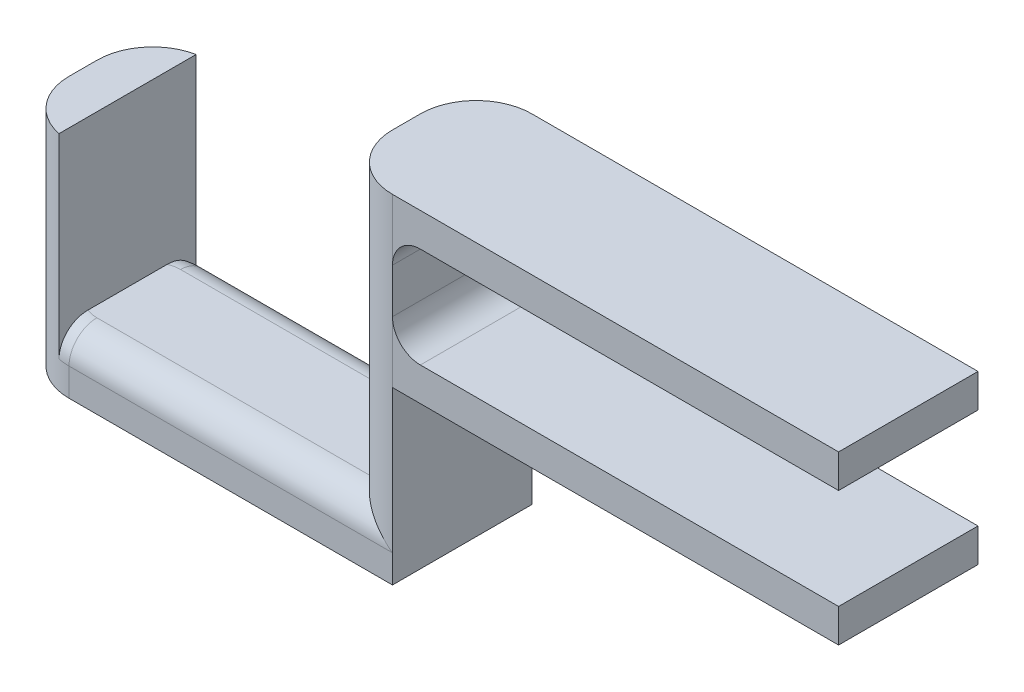
ISO-10303-21;
HEADER;
FILE_DESCRIPTION(('STEP AP214'),'2;1');
FILE_NAME('part.step','',(''),(''),'','','');
FILE_SCHEMA(('AUTOMOTIVE_DESIGN { 1 0 10303 214 1 1 1 1 }'));
ENDSEC;
DATA;
#1=APPLICATION_CONTEXT('core data for automotive mechanical design processes');
#2=APPLICATION_PROTOCOL_DEFINITION('international standard','automotive_design',2000,#1);
#3=PRODUCT_CONTEXT('',#1,'mechanical');
#4=PRODUCT('Part','Part','',(#3));
#5=PRODUCT_RELATED_PRODUCT_CATEGORY('part','',(#4));
#6=PRODUCT_DEFINITION_FORMATION('','',#4);
#7=PRODUCT_DEFINITION_CONTEXT('part definition',#1,'design');
#8=PRODUCT_DEFINITION('design','',#6,#7);
#9=PRODUCT_DEFINITION_SHAPE('','',#8);
#10=(LENGTH_UNIT() NAMED_UNIT(*) SI_UNIT(.MILLI.,.METRE.));
#11=(NAMED_UNIT(*) PLANE_ANGLE_UNIT() SI_UNIT($,.RADIAN.));
#12=(NAMED_UNIT(*) SI_UNIT($,.STERADIAN.) SOLID_ANGLE_UNIT());
#13=UNCERTAINTY_MEASURE_WITH_UNIT(LENGTH_MEASURE(1.E-05),#10,'distance_accuracy_value','');
#14=(GEOMETRIC_REPRESENTATION_CONTEXT(3) GLOBAL_UNCERTAINTY_ASSIGNED_CONTEXT((#13)) GLOBAL_UNIT_ASSIGNED_CONTEXT((#10,
#11,#12)) REPRESENTATION_CONTEXT('',''));
#15=CARTESIAN_POINT('',(0.,0.,0.));
#16=DIRECTION('',(0.,0.,1.));
#17=DIRECTION('',(1.,0.,0.));
#18=AXIS2_PLACEMENT_3D('',#15,#16,#17);
#19=CARTESIAN_POINT('',(17.70619495042,21.6478494623656,0.));
#20=DIRECTION('',(0.,0.,1.));
#21=DIRECTION('',(1.,0.,0.));
#22=AXIS2_PLACEMENT_3D('',#19,#20,#21);
#23=PLANE('',#22);
#24=DIRECTION('',(0.,-1.,0.));
#25=VECTOR('',#24,1.);
#26=CARTESIAN_POINT('',(-45.29380504958,21.6478494623656,0.));
#27=LINE('',#26,#25);
#28=CARTESIAN_POINT('',(-45.29380504958,-28.0241935483871,0.));
#29=VERTEX_POINT('',#28);
#30=CARTESIAN_POINT('',(-45.29380504958,-23.0241935483871,0.));
#31=VERTEX_POINT('',#30);
#32=EDGE_CURVE('E301',#29,#31,#27,.F.);
#33=ORIENTED_EDGE('',*,*,#32,.T.);
#34=DIRECTION('',(-1.,0.,0.));
#35=VECTOR('',#34,1.);
#36=CARTESIAN_POINT('',(17.70619495042,-23.0241935483871,0.));
#37=LINE('',#36,#35);
#38=CARTESIAN_POINT('',(12.70619495042,-23.0241935483871,0.));
#39=VERTEX_POINT('',#38);
#40=EDGE_CURVE('E359',#31,#39,#37,.F.);
#41=ORIENTED_EDGE('',*,*,#40,.T.);
#42=DIRECTION('',(0.,1.,0.));
#43=VECTOR('',#42,1.);
#44=CARTESIAN_POINT('',(12.70619495042,-28.0241935483871,0.));
#45=LINE('',#44,#43);
#46=CARTESIAN_POINT('',(12.70619495042,-28.0241935483871,0.));
#47=VERTEX_POINT('',#46);
#48=EDGE_CURVE('E236',#47,#39,#45,.T.);
#49=ORIENTED_EDGE('',*,*,#48,.F.);
#50=DIRECTION('',(1.,0.,0.));
#51=VECTOR('',#50,1.);
#52=CARTESIAN_POINT('',(-55.29380504958,-28.0241935483871,0.));
#53=LINE('',#52,#51);
#54=EDGE_CURVE('E204',#29,#47,#53,.T.);
#55=ORIENTED_EDGE('',*,*,#54,.F.);
#56=EDGE_LOOP('',(#33,#41,#49,#55));
#57=FACE_BOUND('',#56,.T.);
#58=ADVANCED_FACE('F35',(#57),#23,.F.);
#59=DIRECTION('',(1.,0.,0.));
#60=VECTOR('',#59,1.);
#61=CARTESIAN_POINT('',(12.70619495042,2.64784946236562,0.));
#62=LINE('',#61,#60);
#63=CARTESIAN_POINT('',(12.70619495042,2.64784946236562,0.));
#64=VERTEX_POINT('',#63);
#65=CARTESIAN_POINT('',(92.70619495042,2.64784946236562,0.));
#66=VERTEX_POINT('',#65);
#67=EDGE_CURVE('E238',#64,#66,#62,.T.);
#68=ORIENTED_EDGE('',*,*,#67,.F.);
#69=DIRECTION('',(0.,-1.,0.));
#70=VECTOR('',#69,1.);
#71=CARTESIAN_POINT('',(12.70619495042,21.6478494623656,0.));
#72=LINE('',#71,#70);
#73=CARTESIAN_POINT('',(12.70619495042,13.6478494623656,0.));
#74=VERTEX_POINT('',#73);
#75=EDGE_CURVE('E335',#64,#74,#72,.F.);
#76=ORIENTED_EDGE('',*,*,#75,.T.);
#77=CARTESIAN_POINT('',(17.70619495042,13.6478494623656,0.));
#78=DIRECTION('',(0.,0.,-1.));
#79=DIRECTION('',(-1.,0.,0.));
#80=AXIS2_PLACEMENT_3D('',#77,#78,#79);
#81=CIRCLE('',#80,5.);
#82=CARTESIAN_POINT('',(17.70619495042,8.64784946236562,0.));
#83=VERTEX_POINT('',#82);
#84=EDGE_CURVE('E244',#83,#74,#81,.T.);
#85=ORIENTED_EDGE('',*,*,#84,.F.);
#86=DIRECTION('',(-1.,0.,0.));
#87=VECTOR('',#86,1.);
#88=CARTESIAN_POINT('',(17.70619495042,8.64784946236562,0.));
#89=LINE('',#88,#87);
#90=CARTESIAN_POINT('',(92.70619495042,8.64784946236562,0.));
#91=VERTEX_POINT('',#90);
#92=EDGE_CURVE('E242',#91,#83,#89,.T.);
#93=ORIENTED_EDGE('',*,*,#92,.F.);
#94=DIRECTION('',(0.,1.,0.));
#95=VECTOR('',#94,1.);
#96=CARTESIAN_POINT('',(92.70619495042,8.64784946236562,0.));
#97=LINE('',#96,#95);
#98=EDGE_CURVE('E240',#66,#91,#97,.T.);
#99=ORIENTED_EDGE('',*,*,#98,.F.);
#100=EDGE_LOOP('',(#68,#76,#85,#93,#99));
#101=FACE_BOUND('',#100,.T.);
#102=ADVANCED_FACE('F478',(#101),#23,.F.);
#103=CARTESIAN_POINT('',(17.70619495042,21.6478494623656,25.));
#104=DIRECTION('',(0.,0.,1.));
#105=DIRECTION('',(1.,0.,0.));
#106=AXIS2_PLACEMENT_3D('',#103,#104,#105);
#107=PLANE('',#106);
#108=DIRECTION('',(-1.,0.,0.));
#109=VECTOR('',#108,1.);
#110=CARTESIAN_POINT('',(2.70619495042004,32.6478494623656,25.));
#111=LINE('',#110,#109);
#112=CARTESIAN_POINT('',(92.7061949504201,32.6478494623656,25.));
#113=VERTEX_POINT('',#112);
#114=CARTESIAN_POINT('',(12.70619495042,32.6478494623656,25.));
#115=VERTEX_POINT('',#114);
#116=EDGE_CURVE('E229',#113,#115,#111,.T.);
#117=ORIENTED_EDGE('',*,*,#116,.T.);
#118=DIRECTION('',(0.,-1.,0.));
#119=VECTOR('',#118,1.);
#120=CARTESIAN_POINT('',(12.70619495042,-18.0241935483871,25.));
#121=LINE('',#120,#119);
#122=CARTESIAN_POINT('',(12.70619495042,21.6478494623656,25.));
#123=VERTEX_POINT('',#122);
#124=EDGE_CURVE('E321',#115,#123,#121,.T.);
#125=ORIENTED_EDGE('',*,*,#124,.T.);
#126=CARTESIAN_POINT('',(17.70619495042,21.6478494623656,25.));
#127=DIRECTION('',(0.,0.,-1.));
#128=DIRECTION('',(1.,0.,0.));
#129=AXIS2_PLACEMENT_3D('',#126,#127,#128);
#130=CIRCLE('',#129,5.00000000000001);
#131=CARTESIAN_POINT('',(17.70619495042,26.6478494623656,25.));
#132=VERTEX_POINT('',#131);
#133=EDGE_CURVE('E223',#123,#132,#130,.T.);
#134=ORIENTED_EDGE('',*,*,#133,.T.);
#135=DIRECTION('',(1.,0.,0.));
#136=VECTOR('',#135,1.);
#137=CARTESIAN_POINT('',(17.70619495042,26.6478494623656,25.));
#138=LINE('',#137,#136);
#139=CARTESIAN_POINT('',(92.7061949504201,26.6478494623657,25.));
#140=VERTEX_POINT('',#139);
#141=EDGE_CURVE('E225',#132,#140,#138,.T.);
#142=ORIENTED_EDGE('',*,*,#141,.T.);
#143=DIRECTION('',(0.,1.,0.));
#144=VECTOR('',#143,1.);
#145=CARTESIAN_POINT('',(92.7061949504201,32.6478494623656,25.));
#146=LINE('',#145,#144);
#147=EDGE_CURVE('E227',#140,#113,#146,.T.);
#148=ORIENTED_EDGE('',*,*,#147,.T.);
#149=EDGE_LOOP('',(#117,#125,#134,#142,#148));
#150=FACE_BOUND('',#149,.T.);
#151=ADVANCED_FACE('F483',(#150),#107,.T.);
#152=CARTESIAN_POINT('',(17.70619495042,13.6478494623656,25.));
#153=DIRECTION('',(0.,0.,-1.));
#154=DIRECTION('',(-1.,0.,0.));
#155=AXIS2_PLACEMENT_3D('',#152,#153,#154);
#156=CIRCLE('',#155,5.);
#157=CARTESIAN_POINT('',(17.70619495042,8.64784946236562,25.));
#158=VERTEX_POINT('',#157);
#159=CARTESIAN_POINT('',(12.70619495042,13.6478494623656,25.));
#160=VERTEX_POINT('',#159);
#161=EDGE_CURVE('E219',#158,#160,#156,.T.);
#162=ORIENTED_EDGE('',*,*,#161,.T.);
#163=DIRECTION('',(0.,-1.,0.));
#164=VECTOR('',#163,1.);
#165=CARTESIAN_POINT('',(12.70619495042,-18.0241935483871,25.));
#166=LINE('',#165,#164);
#167=CARTESIAN_POINT('',(12.70619495042,2.64784946236562,25.));
#168=VERTEX_POINT('',#167);
#169=EDGE_CURVE('E319',#160,#168,#166,.T.);
#170=ORIENTED_EDGE('',*,*,#169,.T.);
#171=DIRECTION('',(1.,0.,0.));
#172=VECTOR('',#171,1.);
#173=CARTESIAN_POINT('',(12.70619495042,2.64784946236562,25.));
#174=LINE('',#173,#172);
#175=CARTESIAN_POINT('',(92.70619495042,2.64784946236562,25.));
#176=VERTEX_POINT('',#175);
#177=EDGE_CURVE('E211',#168,#176,#174,.T.);
#178=ORIENTED_EDGE('',*,*,#177,.T.);
#179=DIRECTION('',(0.,1.,0.));
#180=VECTOR('',#179,1.);
#181=CARTESIAN_POINT('',(92.70619495042,8.64784946236562,25.));
#182=LINE('',#181,#180);
#183=CARTESIAN_POINT('',(92.70619495042,8.64784946236562,25.));
#184=VERTEX_POINT('',#183);
#185=EDGE_CURVE('E213',#176,#184,#182,.T.);
#186=ORIENTED_EDGE('',*,*,#185,.T.);
#187=DIRECTION('',(-1.,0.,0.));
#188=VECTOR('',#187,1.);
#189=CARTESIAN_POINT('',(17.70619495042,8.64784946236562,25.));
#190=LINE('',#189,#188);
#191=EDGE_CURVE('E217',#184,#158,#190,.T.);
#192=ORIENTED_EDGE('',*,*,#191,.T.);
#193=EDGE_LOOP('',(#162,#170,#178,#186,#192));
#194=FACE_BOUND('',#193,.T.);
#195=ADVANCED_FACE('F421',(#194),#107,.T.);
#196=CARTESIAN_POINT('',(-55.29380504958,11.9758064516129,25.));
#197=DIRECTION('',(0.,-1.,0.));
#198=DIRECTION('',(0.,0.,-1.));
#199=AXIS2_PLACEMENT_3D('',#196,#197,#198);
#200=PLANE('',#199);
#201=DIRECTION('',(0.,0.,-1.));
#202=VECTOR('',#201,1.);
#203=CARTESIAN_POINT('',(-55.29380504958,11.9758064516129,25.));
#204=LINE('',#203,#202);
#205=CARTESIAN_POINT('',(-55.29380504958,11.9758064516129,15.));
#206=VERTEX_POINT('',#205);
#207=CARTESIAN_POINT('',(-55.29380504958,11.9758064516129,10.));
#208=VERTEX_POINT('',#207);
#209=EDGE_CURVE('E294',#206,#208,#204,.T.);
#210=ORIENTED_EDGE('',*,*,#209,.F.);
#211=CARTESIAN_POINT('',(-45.29380504958,11.9758064516129,15.));
#212=DIRECTION('',(0.,-1.,0.));
#213=DIRECTION('',(0.,0.,-1.));
#214=AXIS2_PLACEMENT_3D('',#211,#212,#213);
#215=CIRCLE('',#214,10.);
#216=CARTESIAN_POINT('',(-47.29380504958,11.9758064516129,24.7979589711327));
#217=VERTEX_POINT('',#216);
#218=EDGE_CURVE('E315',#206,#217,#215,.F.);
#219=ORIENTED_EDGE('',*,*,#218,.T.);
#220=DIRECTION('',(0.,0.,-1.));
#221=VECTOR('',#220,1.);
#222=CARTESIAN_POINT('',(-47.29380504958,11.9758064516129,25.));
#223=LINE('',#222,#221);
#224=CARTESIAN_POINT('',(-47.29380504958,11.9758064516129,0.202041028867289));
#225=VERTEX_POINT('',#224);
#226=EDGE_CURVE('E232',#217,#225,#223,.T.);
#227=ORIENTED_EDGE('',*,*,#226,.T.);
#228=CARTESIAN_POINT('',(-45.29380504958,11.9758064516129,10.));
#229=DIRECTION('',(0.,-1.,0.));
#230=DIRECTION('',(0.,0.,-1.));
#231=AXIS2_PLACEMENT_3D('',#228,#229,#230);
#232=CIRCLE('',#231,10.);
#233=EDGE_CURVE('E307',#225,#208,#232,.F.);
#234=ORIENTED_EDGE('',*,*,#233,.T.);
#235=EDGE_LOOP('',(#210,#219,#227,#234));
#236=FACE_BOUND('',#235,.T.);
#237=ADVANCED_FACE('F417',(#236),#200,.F.);
#238=CARTESIAN_POINT('',(-55.29380504958,11.9758064516129,25.));
#239=DIRECTION('',(1.,0.,0.));
#240=DIRECTION('',(0.,0.,-1.));
#241=AXIS2_PLACEMENT_3D('',#238,#239,#240);
#242=PLANE('',#241);
#243=DIRECTION('',(0.,0.,-1.));
#244=VECTOR('',#243,1.);
#245=CARTESIAN_POINT('',(-55.29380504958,-28.0241935483871,25.));
#246=LINE('',#245,#244);
#247=CARTESIAN_POINT('',(-55.29380504958,-28.0241935483871,15.));
#248=VERTEX_POINT('',#247);
#249=CARTESIAN_POINT('',(-55.29380504958,-28.0241935483871,10.));
#250=VERTEX_POINT('',#249);
#251=EDGE_CURVE('E207',#248,#250,#246,.T.);
#252=ORIENTED_EDGE('',*,*,#251,.F.);
#253=DIRECTION('',(0.,-1.,0.));
#254=VECTOR('',#253,1.);
#255=CARTESIAN_POINT('',(-55.29380504958,11.9758064516129,15.));
#256=LINE('',#255,#254);
#257=EDGE_CURVE('E313',#248,#206,#256,.F.);
#258=ORIENTED_EDGE('',*,*,#257,.T.);
#259=ORIENTED_EDGE('',*,*,#209,.T.);
#260=DIRECTION('',(0.,-1.,0.));
#261=VECTOR('',#260,1.);
#262=CARTESIAN_POINT('',(-55.29380504958,11.9758064516129,10.));
#263=LINE('',#262,#261);
#264=EDGE_CURVE('E296',#208,#250,#263,.T.);
#265=ORIENTED_EDGE('',*,*,#264,.T.);
#266=EDGE_LOOP('',(#252,#258,#259,#265));
#267=FACE_BOUND('',#266,.T.);
#268=ADVANCED_FACE('F420',(#267),#242,.F.);
#269=CARTESIAN_POINT('',(-55.29380504958,-28.0241935483871,25.));
#270=DIRECTION('',(0.,1.,0.));
#271=DIRECTION('',(0.,0.,1.));
#272=AXIS2_PLACEMENT_3D('',#269,#270,#271);
#273=PLANE('',#272);
#274=DIRECTION('',(1.,0.,0.));
#275=VECTOR('',#274,1.);
#276=CARTESIAN_POINT('',(-55.29380504958,-28.0241935483871,25.));
#277=LINE('',#276,#275);
#278=CARTESIAN_POINT('',(-45.29380504958,-28.0241935483871,25.));
#279=VERTEX_POINT('',#278);
#280=CARTESIAN_POINT('',(12.70619495042,-28.0241935483871,25.));
#281=VERTEX_POINT('',#280);
#282=EDGE_CURVE('E189',#279,#281,#277,.T.);
#283=ORIENTED_EDGE('',*,*,#282,.F.);
#284=CARTESIAN_POINT('',(-45.29380504958,-28.0241935483871,15.));
#285=DIRECTION('',(0.,1.,0.));
#286=DIRECTION('',(0.,0.,1.));
#287=AXIS2_PLACEMENT_3D('',#284,#285,#286);
#288=CIRCLE('',#287,10.);
#289=EDGE_CURVE('E311',#279,#248,#288,.F.);
#290=ORIENTED_EDGE('',*,*,#289,.T.);
#291=ORIENTED_EDGE('',*,*,#251,.T.);
#292=CARTESIAN_POINT('',(-45.29380504958,-28.0241935483871,10.));
#293=DIRECTION('',(0.,1.,0.));
#294=DIRECTION('',(0.,0.,1.));
#295=AXIS2_PLACEMENT_3D('',#292,#293,#294);
#296=CIRCLE('',#295,10.);
#297=EDGE_CURVE('E299',#250,#29,#296,.F.);
#298=ORIENTED_EDGE('',*,*,#297,.T.);
#299=ORIENTED_EDGE('',*,*,#54,.T.);
#300=DIRECTION('',(0.,0.,-1.));
#301=VECTOR('',#300,1.);
#302=CARTESIAN_POINT('',(12.70619495042,-28.0241935483871,25.));
#303=LINE('',#302,#301);
#304=EDGE_CURVE('E201',#281,#47,#303,.T.);
#305=ORIENTED_EDGE('',*,*,#304,.F.);
#306=EDGE_LOOP('',(#283,#290,#291,#298,#299,#305));
#307=FACE_BOUND('',#306,.T.);
#308=ADVANCED_FACE('F202',(#307),#273,.F.);
#309=CARTESIAN_POINT('',(12.70619495042,-28.0241935483871,25.));
#310=DIRECTION('',(-1.,0.,0.));
#311=DIRECTION('',(0.,-1.,0.));
#312=AXIS2_PLACEMENT_3D('',#309,#310,#311);
#313=PLANE('',#312);
#314=ORIENTED_EDGE('',*,*,#48,.T.);
#315=EDGE_CURVE('E234',#39,#64,#45,.T.);
#316=ORIENTED_EDGE('',*,*,#315,.T.);
#317=DIRECTION('',(0.,0.,-1.));
#318=VECTOR('',#317,1.);
#319=CARTESIAN_POINT('',(12.70619495042,2.64784946236562,25.));
#320=LINE('',#319,#318);
#321=EDGE_CURVE('E208',#168,#64,#320,.T.);
#322=ORIENTED_EDGE('',*,*,#321,.F.);
#323=DIRECTION('',(0.,1.,0.));
#324=VECTOR('',#323,1.);
#325=CARTESIAN_POINT('',(12.70619495042,-28.0241935483871,25.));
#326=LINE('',#325,#324);
#327=CARTESIAN_POINT('',(12.70619495042,-23.0241935483871,25.));
#328=VERTEX_POINT('',#327);
#329=EDGE_CURVE('E53',#328,#168,#326,.T.);
#330=ORIENTED_EDGE('',*,*,#329,.F.);
#331=EDGE_CURVE('E192',#281,#328,#326,.T.);
#332=ORIENTED_EDGE('',*,*,#331,.F.);
#333=ORIENTED_EDGE('',*,*,#304,.T.);
#334=EDGE_LOOP('',(#314,#316,#322,#330,#332,#333));
#335=FACE_BOUND('',#334,.T.);
#336=ADVANCED_FACE('F210',(#335),#313,.F.);
#337=CARTESIAN_POINT('',(12.70619495042,2.64784946236562,25.));
#338=DIRECTION('',(0.,1.,0.));
#339=DIRECTION('',(-1.,0.,0.));
#340=AXIS2_PLACEMENT_3D('',#337,#338,#339);
#341=PLANE('',#340);
#342=ORIENTED_EDGE('',*,*,#67,.T.);
#343=DIRECTION('',(0.,0.,-1.));
#344=VECTOR('',#343,1.);
#345=CARTESIAN_POINT('',(92.70619495042,2.64784946236562,25.));
#346=LINE('',#345,#344);
#347=EDGE_CURVE('E288',#176,#66,#346,.T.);
#348=ORIENTED_EDGE('',*,*,#347,.F.);
#349=ORIENTED_EDGE('',*,*,#177,.F.);
#350=ORIENTED_EDGE('',*,*,#321,.T.);
#351=EDGE_LOOP('',(#342,#348,#349,#350));
#352=FACE_BOUND('',#351,.T.);
#353=ADVANCED_FACE('F430',(#352),#341,.F.);
#354=CARTESIAN_POINT('',(92.70619495042,8.64784946236562,25.));
#355=DIRECTION('',(-1.,0.,0.));
#356=DIRECTION('',(0.,0.,1.));
#357=AXIS2_PLACEMENT_3D('',#354,#355,#356);
#358=PLANE('',#357);
#359=ORIENTED_EDGE('',*,*,#98,.T.);
#360=DIRECTION('',(0.,0.,-1.));
#361=VECTOR('',#360,1.);
#362=CARTESIAN_POINT('',(92.70619495042,8.64784946236562,25.));
#363=LINE('',#362,#361);
#364=EDGE_CURVE('E285',#184,#91,#363,.T.);
#365=ORIENTED_EDGE('',*,*,#364,.F.);
#366=ORIENTED_EDGE('',*,*,#185,.F.);
#367=ORIENTED_EDGE('',*,*,#347,.T.);
#368=EDGE_LOOP('',(#359,#365,#366,#367));
#369=FACE_BOUND('',#368,.T.);
#370=ADVANCED_FACE('F433',(#369),#358,.F.);
#371=CARTESIAN_POINT('',(17.70619495042,8.64784946236562,25.));
#372=DIRECTION('',(0.,-1.,0.));
#373=DIRECTION('',(1.,0.,0.));
#374=AXIS2_PLACEMENT_3D('',#371,#372,#373);
#375=PLANE('',#374);
#376=ORIENTED_EDGE('',*,*,#92,.T.);
#377=DIRECTION('',(0.,0.,-1.));
#378=VECTOR('',#377,1.);
#379=CARTESIAN_POINT('',(17.70619495042,8.64784946236562,25.));
#380=LINE('',#379,#378);
#381=EDGE_CURVE('E282',#158,#83,#380,.T.);
#382=ORIENTED_EDGE('',*,*,#381,.F.);
#383=ORIENTED_EDGE('',*,*,#191,.F.);
#384=ORIENTED_EDGE('',*,*,#364,.T.);
#385=EDGE_LOOP('',(#376,#382,#383,#384));
#386=FACE_BOUND('',#385,.T.);
#387=ADVANCED_FACE('F437',(#386),#375,.F.);
#388=CARTESIAN_POINT('',(17.70619495042,13.6478494623656,25.));
#389=DIRECTION('',(0.,0.,-1.));
#390=DIRECTION('',(-1.,0.,0.));
#391=AXIS2_PLACEMENT_3D('',#388,#389,#390);
#392=CYLINDRICAL_SURFACE('',#391,5.);
#393=ORIENTED_EDGE('',*,*,#84,.T.);
#394=DIRECTION('',(0.,0.,-1.));
#395=VECTOR('',#394,1.);
#396=CARTESIAN_POINT('',(12.70619495042,13.6478494623656,25.));
#397=LINE('',#396,#395);
#398=EDGE_CURVE('E279',#160,#74,#397,.T.);
#399=ORIENTED_EDGE('',*,*,#398,.F.);
#400=ORIENTED_EDGE('',*,*,#161,.F.);
#401=ORIENTED_EDGE('',*,*,#381,.T.);
#402=EDGE_LOOP('',(#393,#399,#400,#401));
#403=FACE_BOUND('',#402,.T.);
#404=ADVANCED_FACE('F441',(#403),#392,.F.);
#405=CARTESIAN_POINT('',(12.70619495042,21.6478494623656,25.));
#406=DIRECTION('',(-1.,0.,0.));
#407=DIRECTION('',(0.,-1.,0.));
#408=AXIS2_PLACEMENT_3D('',#405,#406,#407);
#409=PLANE('',#408);
#410=DIRECTION('',(0.,1.,0.));
#411=VECTOR('',#410,1.);
#412=CARTESIAN_POINT('',(12.70619495042,21.6478494623656,0.));
#413=LINE('',#412,#411);
#414=CARTESIAN_POINT('',(12.70619495042,21.6478494623656,0.));
#415=VERTEX_POINT('',#414);
#416=EDGE_CURVE('E247',#74,#415,#413,.T.);
#417=ORIENTED_EDGE('',*,*,#416,.T.);
#418=DIRECTION('',(0.,0.,-1.));
#419=VECTOR('',#418,1.);
#420=CARTESIAN_POINT('',(12.70619495042,21.6478494623656,25.));
#421=LINE('',#420,#419);
#422=EDGE_CURVE('E276',#123,#415,#421,.T.);
#423=ORIENTED_EDGE('',*,*,#422,.F.);
#424=DIRECTION('',(0.,1.,0.));
#425=VECTOR('',#424,1.);
#426=CARTESIAN_POINT('',(12.70619495042,21.6478494623656,25.));
#427=LINE('',#426,#425);
#428=EDGE_CURVE('E221',#160,#123,#427,.T.);
#429=ORIENTED_EDGE('',*,*,#428,.F.);
#430=ORIENTED_EDGE('',*,*,#398,.T.);
#431=EDGE_LOOP('',(#417,#423,#429,#430));
#432=FACE_BOUND('',#431,.T.);
#433=ADVANCED_FACE('F445',(#432),#409,.F.);
#434=CARTESIAN_POINT('',(17.70619495042,21.6478494623656,25.));
#435=DIRECTION('',(0.,0.,-1.));
#436=DIRECTION('',(-1.,0.,0.));
#437=AXIS2_PLACEMENT_3D('',#434,#435,#436);
#438=CYLINDRICAL_SURFACE('',#437,5.00000000000001);
#439=CARTESIAN_POINT('',(17.70619495042,21.6478494623656,0.));
#440=DIRECTION('',(0.,0.,-1.));
#441=DIRECTION('',(1.,0.,0.));
#442=AXIS2_PLACEMENT_3D('',#439,#440,#441);
#443=CIRCLE('',#442,5.00000000000001);
#444=CARTESIAN_POINT('',(17.70619495042,26.6478494623656,0.));
#445=VERTEX_POINT('',#444);
#446=EDGE_CURVE('E249',#415,#445,#443,.T.);
#447=ORIENTED_EDGE('',*,*,#446,.T.);
#448=DIRECTION('',(0.,0.,-1.));
#449=VECTOR('',#448,1.);
#450=CARTESIAN_POINT('',(17.70619495042,26.6478494623656,25.));
#451=LINE('',#450,#449);
#452=EDGE_CURVE('E273',#132,#445,#451,.T.);
#453=ORIENTED_EDGE('',*,*,#452,.F.);
#454=ORIENTED_EDGE('',*,*,#133,.F.);
#455=ORIENTED_EDGE('',*,*,#422,.T.);
#456=EDGE_LOOP('',(#447,#453,#454,#455));
#457=FACE_BOUND('',#456,.T.);
#458=ADVANCED_FACE('F449',(#457),#438,.F.);
#459=CARTESIAN_POINT('',(17.70619495042,26.6478494623656,25.));
#460=DIRECTION('',(0.,1.,0.));
#461=DIRECTION('',(-1.,0.,0.));
#462=AXIS2_PLACEMENT_3D('',#459,#460,#461);
#463=PLANE('',#462);
#464=DIRECTION('',(1.,0.,0.));
#465=VECTOR('',#464,1.);
#466=CARTESIAN_POINT('',(17.70619495042,26.6478494623656,0.));
#467=LINE('',#466,#465);
#468=CARTESIAN_POINT('',(92.7061949504201,26.6478494623657,0.));
#469=VERTEX_POINT('',#468);
#470=EDGE_CURVE('E251',#445,#469,#467,.T.);
#471=ORIENTED_EDGE('',*,*,#470,.T.);
#472=DIRECTION('',(0.,0.,-1.));
#473=VECTOR('',#472,1.);
#474=CARTESIAN_POINT('',(92.7061949504201,26.6478494623657,25.));
#475=LINE('',#474,#473);
#476=EDGE_CURVE('E270',#140,#469,#475,.T.);
#477=ORIENTED_EDGE('',*,*,#476,.F.);
#478=ORIENTED_EDGE('',*,*,#141,.F.);
#479=ORIENTED_EDGE('',*,*,#452,.T.);
#480=EDGE_LOOP('',(#471,#477,#478,#479));
#481=FACE_BOUND('',#480,.T.);
#482=ADVANCED_FACE('F453',(#481),#463,.F.);
#483=CARTESIAN_POINT('',(92.7061949504201,32.6478494623656,25.));
#484=DIRECTION('',(-1.,0.,0.));
#485=DIRECTION('',(0.,0.,1.));
#486=AXIS2_PLACEMENT_3D('',#483,#484,#485);
#487=PLANE('',#486);
#488=DIRECTION('',(0.,1.,0.));
#489=VECTOR('',#488,1.);
#490=CARTESIAN_POINT('',(92.7061949504201,32.6478494623656,0.));
#491=LINE('',#490,#489);
#492=CARTESIAN_POINT('',(92.7061949504201,32.6478494623656,0.));
#493=VERTEX_POINT('',#492);
#494=EDGE_CURVE('E253',#469,#493,#491,.T.);
#495=ORIENTED_EDGE('',*,*,#494,.T.);
#496=DIRECTION('',(0.,0.,-1.));
#497=VECTOR('',#496,1.);
#498=CARTESIAN_POINT('',(92.7061949504201,32.6478494623656,25.));
#499=LINE('',#498,#497);
#500=EDGE_CURVE('E267',#113,#493,#499,.T.);
#501=ORIENTED_EDGE('',*,*,#500,.F.);
#502=ORIENTED_EDGE('',*,*,#147,.F.);
#503=ORIENTED_EDGE('',*,*,#476,.T.);
#504=EDGE_LOOP('',(#495,#501,#502,#503));
#505=FACE_BOUND('',#504,.T.);
#506=ADVANCED_FACE('F457',(#505),#487,.F.);
#507=CARTESIAN_POINT('',(2.70619495042004,32.6478494623656,25.));
#508=DIRECTION('',(0.,-1.,0.));
#509=DIRECTION('',(0.,0.,-1.));
#510=AXIS2_PLACEMENT_3D('',#507,#508,#509);
#511=PLANE('',#510);
#512=DIRECTION('',(0.,0.,-1.));
#513=VECTOR('',#512,1.);
#514=CARTESIAN_POINT('',(2.70619495042004,32.6478494623656,25.));
#515=LINE('',#514,#513);
#516=CARTESIAN_POINT('',(2.70619495042004,32.6478494623656,15.));
#517=VERTEX_POINT('',#516);
#518=CARTESIAN_POINT('',(2.70619495042004,32.6478494623656,10.));
#519=VERTEX_POINT('',#518);
#520=EDGE_CURVE('E264',#517,#519,#515,.T.);
#521=ORIENTED_EDGE('',*,*,#520,.F.);
#522=CARTESIAN_POINT('',(12.70619495042,32.6478494623656,15.));
#523=DIRECTION('',(0.,-1.,0.));
#524=DIRECTION('',(0.,0.,-1.));
#525=AXIS2_PLACEMENT_3D('',#522,#523,#524);
#526=CIRCLE('',#525,10.);
#527=EDGE_CURVE('E331',#517,#115,#526,.F.);
#528=ORIENTED_EDGE('',*,*,#527,.T.);
#529=ORIENTED_EDGE('',*,*,#116,.F.);
#530=ORIENTED_EDGE('',*,*,#500,.T.);
#531=DIRECTION('',(-1.,0.,0.));
#532=VECTOR('',#531,1.);
#533=CARTESIAN_POINT('',(2.70619495042004,32.6478494623656,0.));
#534=LINE('',#533,#532);
#535=CARTESIAN_POINT('',(12.70619495042,32.6478494623656,0.));
#536=VERTEX_POINT('',#535);
#537=EDGE_CURVE('E198',#493,#536,#534,.T.);
#538=ORIENTED_EDGE('',*,*,#537,.T.);
#539=CARTESIAN_POINT('',(12.70619495042,32.6478494623656,10.));
#540=DIRECTION('',(0.,-1.,0.));
#541=DIRECTION('',(0.,0.,-1.));
#542=AXIS2_PLACEMENT_3D('',#539,#540,#541);
#543=CIRCLE('',#542,10.);
#544=EDGE_CURVE('E329',#536,#519,#543,.F.);
#545=ORIENTED_EDGE('',*,*,#544,.T.);
#546=EDGE_LOOP('',(#521,#528,#529,#530,#538,#545));
#547=FACE_BOUND('',#546,.T.);
#548=ADVANCED_FACE('F461',(#547),#511,.F.);
#549=CARTESIAN_POINT('',(2.70619495042004,-18.0241935483871,25.));
#550=DIRECTION('',(1.,0.,0.));
#551=DIRECTION('',(0.,0.,-1.));
#552=AXIS2_PLACEMENT_3D('',#549,#550,#551);
#553=PLANE('',#552);
#554=DIRECTION('',(0.,0.,-1.));
#555=VECTOR('',#554,1.);
#556=CARTESIAN_POINT('',(2.70619495042004,-18.0241935483871,25.));
#557=LINE('',#556,#555);
#558=CARTESIAN_POINT('',(2.70619495042004,-18.0241935483871,15.));
#559=VERTEX_POINT('',#558);
#560=CARTESIAN_POINT('',(2.70619495042004,-18.0241935483871,10.));
#561=VERTEX_POINT('',#560);
#562=EDGE_CURVE('E261',#559,#561,#557,.T.);
#563=ORIENTED_EDGE('',*,*,#562,.F.);
#564=DIRECTION('',(0.,-1.,0.));
#565=VECTOR('',#564,1.);
#566=CARTESIAN_POINT('',(2.70619495042004,32.6478494623656,15.));
#567=LINE('',#566,#565);
#568=EDGE_CURVE('E327',#559,#517,#567,.F.);
#569=ORIENTED_EDGE('',*,*,#568,.T.);
#570=ORIENTED_EDGE('',*,*,#520,.T.);
#571=DIRECTION('',(0.,-1.,0.));
#572=VECTOR('',#571,1.);
#573=CARTESIAN_POINT('',(2.70619495042004,-18.0241935483871,10.));
#574=LINE('',#573,#572);
#575=EDGE_CURVE('E324',#519,#561,#574,.T.);
#576=ORIENTED_EDGE('',*,*,#575,.T.);
#577=EDGE_LOOP('',(#563,#569,#570,#576));
#578=FACE_BOUND('',#577,.T.);
#579=ADVANCED_FACE('F465',(#578),#553,.F.);
#580=CARTESIAN_POINT('',(-47.29380504958,-18.0241935483871,25.));
#581=DIRECTION('',(0.,-1.,0.));
#582=DIRECTION('',(0.,0.,-1.));
#583=AXIS2_PLACEMENT_3D('',#580,#581,#582);
#584=PLANE('',#583);
#585=DIRECTION('',(0.,0.,-1.));
#586=VECTOR('',#585,1.);
#587=CARTESIAN_POINT('',(-47.29380504958,-18.0241935483871,25.));
#588=LINE('',#587,#586);
#589=CARTESIAN_POINT('',(-47.29380504958,-18.0241935483871,19.5825756949558));
#590=VERTEX_POINT('',#589);
#591=CARTESIAN_POINT('',(-47.29380504958,-18.0241935483871,5.41742430504416));
#592=VERTEX_POINT('',#591);
#593=EDGE_CURVE('E258',#590,#592,#588,.T.);
#594=ORIENTED_EDGE('',*,*,#593,.F.);
#595=CARTESIAN_POINT('',(-45.29380504958,-18.0241935483871,15.));
#596=DIRECTION('',(0.,-1.,0.));
#597=DIRECTION('',(0.,0.,-1.));
#598=AXIS2_PLACEMENT_3D('',#595,#596,#597);
#599=CIRCLE('',#598,5.);
#600=CARTESIAN_POINT('',(-45.29380504958,-18.0241935483871,20.));
#601=VERTEX_POINT('',#600);
#602=EDGE_CURVE('E349',#590,#601,#599,.F.);
#603=ORIENTED_EDGE('',*,*,#602,.T.);
#604=DIRECTION('',(-1.,0.,0.));
#605=VECTOR('',#604,1.);
#606=CARTESIAN_POINT('',(12.70619495042,-18.0241935483871,20.));
#607=LINE('',#606,#605);
#608=CARTESIAN_POINT('',(4.04594091257565,-18.0241935483871,20.));
#609=VERTEX_POINT('',#608);
#610=EDGE_CURVE('E347',#601,#609,#607,.F.);
#611=ORIENTED_EDGE('',*,*,#610,.T.);
#612=CARTESIAN_POINT('',(12.70619495042,-18.0241935483871,15.));
#613=DIRECTION('',(0.,-1.,0.));
#614=DIRECTION('',(0.,0.,-1.));
#615=AXIS2_PLACEMENT_3D('',#612,#613,#614);
#616=CIRCLE('',#615,10.);
#617=EDGE_CURVE('E337',#609,#559,#616,.T.);
#618=ORIENTED_EDGE('',*,*,#617,.T.);
#619=ORIENTED_EDGE('',*,*,#562,.T.);
#620=CARTESIAN_POINT('',(12.70619495042,-18.0241935483871,10.));
#621=DIRECTION('',(0.,-1.,0.));
#622=DIRECTION('',(0.,0.,-1.));
#623=AXIS2_PLACEMENT_3D('',#620,#621,#622);
#624=CIRCLE('',#623,10.);
#625=CARTESIAN_POINT('',(4.04594091257565,-18.0241935483871,5.));
#626=VERTEX_POINT('',#625);
#627=EDGE_CURVE('E339',#561,#626,#624,.T.);
#628=ORIENTED_EDGE('',*,*,#627,.T.);
#629=DIRECTION('',(-1.,0.,0.));
#630=VECTOR('',#629,1.);
#631=CARTESIAN_POINT('',(-47.29380504958,-18.0241935483871,5.));
#632=LINE('',#631,#630);
#633=CARTESIAN_POINT('',(-45.29380504958,-18.0241935483871,5.));
#634=VERTEX_POINT('',#633);
#635=EDGE_CURVE('E342',#626,#634,#632,.T.);
#636=ORIENTED_EDGE('',*,*,#635,.T.);
#637=CARTESIAN_POINT('',(-45.29380504958,-18.0241935483871,10.));
#638=DIRECTION('',(0.,-1.,0.));
#639=DIRECTION('',(0.,0.,-1.));
#640=AXIS2_PLACEMENT_3D('',#637,#638,#639);
#641=CIRCLE('',#640,5.);
#642=EDGE_CURVE('E344',#634,#592,#641,.F.);
#643=ORIENTED_EDGE('',*,*,#642,.T.);
#644=EDGE_LOOP('',(#594,#603,#611,#618,#619,#628,#636,#643));
#645=FACE_BOUND('',#644,.T.);
#646=ADVANCED_FACE('F468',(#645),#584,.F.);
#647=CARTESIAN_POINT('',(-47.29380504958,11.9758064516129,25.));
#648=DIRECTION('',(-1.,0.,0.));
#649=DIRECTION('',(0.,-1.,0.));
#650=AXIS2_PLACEMENT_3D('',#647,#648,#649);
#651=PLANE('',#650);
#652=ORIENTED_EDGE('',*,*,#226,.F.);
#653=DIRECTION('',(0.,1.,0.));
#654=VECTOR('',#653,1.);
#655=CARTESIAN_POINT('',(-47.29380504958,11.9758064516129,24.7979589711327));
#656=LINE('',#655,#654);
#657=CARTESIAN_POINT('',(-47.29380504958,-23.0241935483871,24.7979589711327));
#658=VERTEX_POINT('',#657);
#659=EDGE_CURVE('E317',#217,#658,#656,.F.);
#660=ORIENTED_EDGE('',*,*,#659,.T.);
#661=CARTESIAN_POINT('',(-47.29380504958,-23.0241935483871,24.7979589711327));
#662=CARTESIAN_POINT('',(-47.29380504958,-22.8859651648969,24.797974863882));
#663=CARTESIAN_POINT('',(-47.29380504958,-22.7477394478978,24.7921093269723));
#664=CARTESIAN_POINT('',(-47.29380504958,-22.4722857943004,24.7687304329785));
#665=CARTESIAN_POINT('',(-47.29380504958,-22.3350577892406,24.7512178828683));
#666=CARTESIAN_POINT('',(-47.29380504958,-22.0627308240406,24.7046870099743));
#667=CARTESIAN_POINT('',(-47.29380504958,-21.9276295761967,24.6756820744526));
#668=CARTESIAN_POINT('',(-47.29380504958,-21.6603536066177,24.6063906303786));
#669=CARTESIAN_POINT('',(-47.29380504958,-21.5281788599346,24.56610421804));
#670=CARTESIAN_POINT('',(-47.29380504958,-21.2676643944829,24.4745436170535));
#671=CARTESIAN_POINT('',(-47.29380504958,-21.1393253960351,24.4232673792002));
#672=CARTESIAN_POINT('',(-47.29380504958,-20.8873615848809,24.3100966954855));
#673=CARTESIAN_POINT('',(-47.29380504958,-20.7637385285816,24.248198339812));
#674=CARTESIAN_POINT('',(-47.29380504958,-20.5221638763354,24.1142875949));
#675=CARTESIAN_POINT('',(-47.29380504958,-20.4042100066283,24.0422793067001));
#676=CARTESIAN_POINT('',(-47.29380504958,-20.174684619787,23.888638279704));
#677=CARTESIAN_POINT('',(-47.29380504958,-20.063115487018,23.8070019797381));
#678=CARTESIAN_POINT('',(-47.29380504958,-19.8466129089205,23.6342978436439));
#679=CARTESIAN_POINT('',(-47.29380504958,-19.7417156653541,23.543184630746));
#680=CARTESIAN_POINT('',(-47.29380504958,-19.5398307321953,23.3525120795387));
#681=CARTESIAN_POINT('',(-47.29380504958,-19.4428459579115,23.2529496554794));
#682=CARTESIAN_POINT('',(-47.29380504958,-19.2574906151759,23.0461860796687));
#683=CARTESIAN_POINT('',(-47.29380504958,-19.16911632084,22.9389882669375));
#684=CARTESIAN_POINT('',(-47.29380504958,-19.0014444002435,22.7176563104209));
#685=CARTESIAN_POINT('',(-47.29380504958,-18.9221501218085,22.6035196318505));
#686=CARTESIAN_POINT('',(-47.29380504958,-18.7718561038709,22.367160047767));
#687=CARTESIAN_POINT('',(-47.29380504958,-18.7010212680058,22.2448322878787));
#688=CARTESIAN_POINT('',(-47.29380504958,-18.5696067687389,21.9947336067368));
#689=CARTESIAN_POINT('',(-47.29380504958,-18.5090310521599,21.8669606141817));
#690=CARTESIAN_POINT('',(-47.29380504958,-18.3984393026254,21.6069089315511));
#691=CARTESIAN_POINT('',(-47.29380504958,-18.3484240887651,21.4746298929004));
#692=CARTESIAN_POINT('',(-47.29380504958,-18.2591140711122,21.2064924479862));
#693=CARTESIAN_POINT('',(-47.29380504958,-18.2198222711645,21.0706330504546));
#694=CARTESIAN_POINT('',(-47.29380504958,-18.1313605543916,20.7125027197803));
#695=CARTESIAN_POINT('',(-47.29380504958,-18.0907672547773,20.4880360822984));
#696=CARTESIAN_POINT('',(-47.29380504958,-18.0505840942716,20.1493514292843));
#697=CARTESIAN_POINT('',(-47.29380504958,-18.0406404964613,20.0362308588889));
#698=CARTESIAN_POINT('',(-47.29380504958,-18.0274443215787,19.8096079059137));
#699=CARTESIAN_POINT('',(-47.29380504958,-18.0241911707605,19.6961055569099));
#700=CARTESIAN_POINT('',(-47.29380504958,-18.0241935483871,19.5825756949558));
#701=B_SPLINE_CURVE_WITH_KNOTS('',3,(#661,#662,#663,#664,#665,#666,#667,#668,#669,#670,#671,
#672,#673,#674,#675,#676,#677,#678,#679,#680,#681,#682,#683,#684,#685,#686,#687,#688,#689,#690,
#691,#692,#693,#694,#695,#696,#697,#698,#699,#700),.UNSPECIFIED.,.F.,.F.,(4,2,2,2,2,2,2,2,2,2,2,
2,2,2,2,2,2,2,2,4),(0.,0.414556903854731,0.829085087747365,1.24313180859606,1.65717499837555,
2.07129545952369,2.4855686792658,2.89967433428393,3.31393364023795,3.73027674818729,
4.14677256927972,4.56308735842248,4.97955515302082,5.40314002792744,5.82688749334312,
6.25066781345447,6.67456672143093,7.35684103225449,7.69735152987529,8.03783282546091),.UNSPECIFIED.);
#702=EDGE_CURVE('E362',#658,#590,#701,.T.);
#703=ORIENTED_EDGE('',*,*,#702,.T.);
#704=ORIENTED_EDGE('',*,*,#593,.T.);
#705=CARTESIAN_POINT('',(-47.29380504958,-18.0241935483871,5.41742430504416));
#706=CARTESIAN_POINT('',(-47.29380504958,-18.0241535744276,5.2587497884538));
#707=CARTESIAN_POINT('',(-47.29380504958,-18.0305390553328,5.10003398200018));
#708=CARTESIAN_POINT('',(-47.29380504958,-18.0565064455985,4.78360978728409));
#709=CARTESIAN_POINT('',(-47.29380504958,-18.0760951116582,4.62590195658594));
#710=CARTESIAN_POINT('',(-47.29380504958,-18.1288612954402,4.31247441678535));
#711=CARTESIAN_POINT('',(-47.29380504958,-18.1620625519233,4.15675867330691));
#712=CARTESIAN_POINT('',(-47.29380504958,-18.242122043065,3.84890322654665));
#713=CARTESIAN_POINT('',(-47.29380504958,-18.2889775452105,3.69676281433952));
#714=CARTESIAN_POINT('',(-47.29380504958,-18.3953910958653,3.39970662409379));
#715=CARTESIAN_POINT('',(-47.29380504958,-18.4547358666327,3.2547145277358));
#716=CARTESIAN_POINT('',(-47.29380504958,-18.5862731203523,2.97067908762225));
#717=CARTESIAN_POINT('',(-47.29380504958,-18.658465122478,2.83163552147565));
#718=CARTESIAN_POINT('',(-47.29380504958,-18.8151516054979,2.56090883361818));
#719=CARTESIAN_POINT('',(-47.29380504958,-18.8996293382487,2.42921602411604));
#720=CARTESIAN_POINT('',(-47.29380504958,-19.080364971832,2.17418569863856));
#721=CARTESIAN_POINT('',(-47.29380504958,-19.1766218400161,2.05084745170957));
#722=CARTESIAN_POINT('',(-47.29380504958,-19.3725825405655,1.82250723890059));
#723=CARTESIAN_POINT('',(-47.29380504958,-19.4714935468757,1.71682378352395));
#724=CARTESIAN_POINT('',(-47.29380504958,-19.6781288757185,1.51438175029646));
#725=CARTESIAN_POINT('',(-47.29380504958,-19.7858558844335,1.41762591188457));
#726=CARTESIAN_POINT('',(-47.29380504958,-20.0093495560806,1.23383811018933));
#727=CARTESIAN_POINT('',(-47.29380504958,-20.1251180421923,1.14680836376977));
#728=CARTESIAN_POINT('',(-47.29380504958,-20.3638211443091,0.983206111655142));
#729=CARTESIAN_POINT('',(-47.29380504958,-20.4867555705873,0.906633329278466));
#730=CARTESIAN_POINT('',(-47.29380504958,-20.7350149985312,0.766741377617919));
#731=CARTESIAN_POINT('',(-47.29380504958,-20.8601522602464,0.703088799523593));
#732=CARTESIAN_POINT('',(-47.29380504958,-21.1153529678538,0.586711514596205));
#733=CARTESIAN_POINT('',(-47.29380504958,-21.2454144960165,0.533982604336025));
#734=CARTESIAN_POINT('',(-47.29380504958,-21.5094614073516,0.439869912749958));
#735=CARTESIAN_POINT('',(-47.29380504958,-21.6434435430694,0.398477020592355));
#736=CARTESIAN_POINT('',(-47.29380504958,-21.9144087606459,0.32731266608253));
#737=CARTESIAN_POINT('',(-47.29380504958,-22.0513907491877,0.297537041801464));
#738=CARTESIAN_POINT('',(-47.29380504958,-22.3272818381256,0.249843605428104));
#739=CARTESIAN_POINT('',(-47.29380504958,-22.4661891716495,0.231915572644208));
#740=CARTESIAN_POINT('',(-47.29380504958,-22.7447957213314,0.208015888130949));
#741=CARTESIAN_POINT('',(-47.29380504958,-22.884493239931,0.202024435740591));
#742=CARTESIAN_POINT('',(-47.29380504958,-23.0241935483871,0.202041028867288));
#743=B_SPLINE_CURVE_WITH_KNOTS('',3,(#705,#706,#707,#708,#709,#710,#711,#712,#713,#714,#715,
#716,#717,#718,#719,#720,#721,#722,#723,#724,#725,#726,#727,#728,#729,#730,#731,#732,#733,#734,
#735,#736,#737,#738,#739,#740,#741,#742),.UNSPECIFIED.,.F.,.F.,(4,2,2,2,2,2,2,2,2,2,2,2,2,2,2,2,
2,2,4),(0.,0.475954438058515,0.952152629803888,1.42918481154576,1.90612159419691,
2.37549317317947,2.84484718893075,3.31356726778479,3.78224628448173,4.21596190826369,
4.6498101781352,5.08375713402967,5.51769260586296,5.93837253822677,6.35889029104536,
6.77906907248118,7.19909718480216,7.61876247219596,8.03773102804981),.UNSPECIFIED.);
#744=CARTESIAN_POINT('',(-47.29380504958,-23.0241935483871,0.202041028867287));
#745=VERTEX_POINT('',#744);
#746=EDGE_CURVE('E370',#592,#745,#743,.T.);
#747=ORIENTED_EDGE('',*,*,#746,.T.);
#748=DIRECTION('',(0.,-1.,0.));
#749=VECTOR('',#748,1.);
#750=CARTESIAN_POINT('',(-47.29380504958,-18.0241935483871,0.202041028867287));
#751=LINE('',#750,#749);
#752=EDGE_CURVE('E304',#745,#225,#751,.F.);
#753=ORIENTED_EDGE('',*,*,#752,.T.);
#754=EDGE_LOOP('',(#652,#660,#703,#704,#747,#753));
#755=FACE_BOUND('',#754,.T.);
#756=ADVANCED_FACE('F376',(#755),#651,.F.);
#757=ORIENTED_EDGE('',*,*,#331,.T.);
#758=DIRECTION('',(-1.,0.,0.));
#759=VECTOR('',#758,1.);
#760=CARTESIAN_POINT('',(-45.29380504958,-23.0241935483871,25.));
#761=LINE('',#760,#759);
#762=CARTESIAN_POINT('',(-45.29380504958,-23.0241935483871,25.));
#763=VERTEX_POINT('',#762);
#764=EDGE_CURVE('E357',#328,#763,#761,.T.);
#765=ORIENTED_EDGE('',*,*,#764,.T.);
#766=DIRECTION('',(0.,-1.,0.));
#767=VECTOR('',#766,1.);
#768=CARTESIAN_POINT('',(-45.29380504958,-28.0241935483871,25.));
#769=LINE('',#768,#767);
#770=EDGE_CURVE('E195',#763,#279,#769,.T.);
#771=ORIENTED_EDGE('',*,*,#770,.T.);
#772=ORIENTED_EDGE('',*,*,#282,.T.);
#773=EDGE_LOOP('',(#757,#765,#771,#772));
#774=FACE_BOUND('',#773,.T.);
#775=ADVANCED_FACE('F191',(#774),#107,.T.);
#776=ORIENTED_EDGE('',*,*,#446,.F.);
#777=DIRECTION('',(0.,-1.,0.));
#778=VECTOR('',#777,1.);
#779=CARTESIAN_POINT('',(12.70619495042,21.6478494623656,0.));
#780=LINE('',#779,#778);
#781=EDGE_CURVE('E333',#415,#536,#780,.F.);
#782=ORIENTED_EDGE('',*,*,#781,.T.);
#783=ORIENTED_EDGE('',*,*,#537,.F.);
#784=ORIENTED_EDGE('',*,*,#494,.F.);
#785=ORIENTED_EDGE('',*,*,#470,.F.);
#786=EDGE_LOOP('',(#776,#782,#783,#784,#785));
#787=FACE_BOUND('',#786,.T.);
#788=ADVANCED_FACE('F415',(#787),#23,.F.);
#789=CARTESIAN_POINT('',(-45.29380504958,11.9758064516129,10.));
#790=DIRECTION('',(0.,-1.,0.));
#791=DIRECTION('',(0.,0.,-1.));
#792=AXIS2_PLACEMENT_3D('',#789,#790,#791);
#793=CYLINDRICAL_SURFACE('',#792,10.);
#794=ORIENTED_EDGE('',*,*,#752,.F.);
#795=CARTESIAN_POINT('',(-45.29380504958,-23.0241935483871,10.));
#796=DIRECTION('',(0.,-1.,0.));
#797=DIRECTION('',(0.,0.,-1.));
#798=AXIS2_PLACEMENT_3D('',#795,#796,#797);
#799=CIRCLE('',#798,10.);
#800=EDGE_CURVE('E355',#745,#31,#799,.T.);
#801=ORIENTED_EDGE('',*,*,#800,.T.);
#802=ORIENTED_EDGE('',*,*,#32,.F.);
#803=ORIENTED_EDGE('',*,*,#297,.F.);
#804=ORIENTED_EDGE('',*,*,#264,.F.);
#805=ORIENTED_EDGE('',*,*,#233,.F.);
#806=EDGE_LOOP('',(#794,#801,#802,#803,#804,#805));
#807=FACE_BOUND('',#806,.T.);
#808=ADVANCED_FACE('F411',(#807),#793,.T.);
#809=CARTESIAN_POINT('',(-45.29380504958,21.6478494623656,15.));
#810=DIRECTION('',(0.,1.,0.));
#811=DIRECTION('',(0.,0.,1.));
#812=AXIS2_PLACEMENT_3D('',#809,#810,#811);
#813=CYLINDRICAL_SURFACE('',#812,10.);
#814=ORIENTED_EDGE('',*,*,#770,.F.);
#815=CARTESIAN_POINT('',(-45.29380504958,-23.0241935483871,15.));
#816=DIRECTION('',(0.,-1.,0.));
#817=DIRECTION('',(0.,0.,-1.));
#818=AXIS2_PLACEMENT_3D('',#815,#816,#817);
#819=CIRCLE('',#818,10.);
#820=EDGE_CURVE('E352',#763,#658,#819,.T.);
#821=ORIENTED_EDGE('',*,*,#820,.T.);
#822=ORIENTED_EDGE('',*,*,#659,.F.);
#823=ORIENTED_EDGE('',*,*,#218,.F.);
#824=ORIENTED_EDGE('',*,*,#257,.F.);
#825=ORIENTED_EDGE('',*,*,#289,.F.);
#826=EDGE_LOOP('',(#814,#821,#822,#823,#824,#825));
#827=FACE_BOUND('',#826,.T.);
#828=ADVANCED_FACE('F407',(#827),#813,.T.);
#829=CARTESIAN_POINT('',(12.70619495042,21.6478494623656,15.));
#830=DIRECTION('',(0.,1.,0.));
#831=DIRECTION('',(0.,0.,1.));
#832=AXIS2_PLACEMENT_3D('',#829,#830,#831);
#833=CYLINDRICAL_SURFACE('',#832,10.);
#834=ORIENTED_EDGE('',*,*,#527,.F.);
#835=ORIENTED_EDGE('',*,*,#568,.F.);
#836=ORIENTED_EDGE('',*,*,#617,.F.);
#837=CARTESIAN_POINT('',(4.04594091257565,-18.0241935483871,20.));
#838=CARTESIAN_POINT('',(4.09998294296224,-18.0241938312879,20.0936098039848));
#839=CARTESIAN_POINT('',(4.15553199546798,-18.0268224229385,20.1863112644491));
#840=CARTESIAN_POINT('',(4.26945481809865,-18.0370308013201,20.3696413860299));
#841=CARTESIAN_POINT('',(4.32782759292089,-18.0446088550759,20.4602707611627));
#842=CARTESIAN_POINT('',(4.50662796954911,-18.0742579033994,20.7282724403887));
#843=CARTESIAN_POINT('',(4.6310364065481,-18.10324720052,20.9022749609317));
#844=CARTESIAN_POINT('',(4.8871505156643,-18.1767554060585,21.2375074983312));
#845=CARTESIAN_POINT('',(5.01873770491192,-18.221063529927,21.398876166368));
#846=CARTESIAN_POINT('',(5.28947354955523,-18.3231207129723,21.7108067987731));
#847=CARTESIAN_POINT('',(5.4286277100475,-18.3808796608961,21.8613607052986));
#848=CARTESIAN_POINT('',(5.74030666576374,-18.5199287692904,22.1787769966391));
#849=CARTESIAN_POINT('',(5.91414636354216,-18.6036049279228,22.3432986936849));
#850=CARTESIAN_POINT('',(6.26905321523493,-18.7843072726229,22.6563187489263));
#851=CARTESIAN_POINT('',(6.45012052374211,-18.8813337443518,22.8048167641364));
#852=CARTESIAN_POINT('',(6.81916200888484,-19.0869351036577,23.0868459912028));
#853=CARTESIAN_POINT('',(7.00716924099304,-19.1955717381902,23.2202885435333));
#854=CARTESIAN_POINT('',(7.38802964910987,-19.4219552505915,23.4716706657225));
#855=CARTESIAN_POINT('',(7.58088422586146,-19.539704782746,23.5896056915503));
#856=CARTESIAN_POINT('',(8.04945901223716,-19.8318627688825,23.8551586322553));
#857=CARTESIAN_POINT('',(8.32709258714605,-20.0098966994269,23.9954410395129));
#858=CARTESIAN_POINT('',(8.88806850860824,-20.3768936219793,24.247514860227));
#859=CARTESIAN_POINT('',(9.1714133559431,-20.565861472451,24.3592934869401));
#860=CARTESIAN_POINT('',(9.74171702482254,-20.9514032697632,24.5552412924629));
#861=CARTESIAN_POINT('',(10.0286697603271,-21.1479653318485,24.6394518022138));
#862=CARTESIAN_POINT('',(10.6052094586432,-21.5464209541422,24.7813060533288));
#863=CARTESIAN_POINT('',(10.8947952323673,-21.7483121791385,24.8389612332895));
#864=CARTESIAN_POINT('',(11.4352867883,-22.1271093457927,24.9221379454986));
#865=CARTESIAN_POINT('',(11.685983199129,-22.3035943493731,24.9510085495314));
#866=CARTESIAN_POINT('',(12.1877623344076,-22.6576144860949,24.9897179572053));
#867=CARTESIAN_POINT('',(12.4388443718578,-22.8351483142845,24.9995768157015));
#868=CARTESIAN_POINT('',(12.6953083583132,-23.0164955654663,24.9999955542052));
#869=CARTESIAN_POINT('',(12.7007516707706,-23.0203445686244,24.9999999985291));
#870=CARTESIAN_POINT('',(12.70619495042,-23.0241935483871,25.));
#871=B_SPLINE_CURVE_WITH_KNOTS('',3,(#837,#838,#839,#840,#841,#842,#843,#844,#845,#846,#847,
#848,#849,#850,#851,#852,#853,#854,#855,#856,#857,#858,#859,#860,#861,#862,#863,#864,#865,#866,
#867,#868,#869,#870),.UNSPECIFIED.,.F.,.F.,(4,2,2,2,2,2,2,2,2,2,2,2,2,2,2,2,4),(0.,
0.324164501699159,0.648215563169987,1.2945369051522,1.93229735394222,2.57052815854179,
3.33008992767271,4.08966795194079,4.85350822338372,5.6175718196543,6.69122947966728,
7.76536793656898,8.83788855857113,9.90994676377596,10.8332249647611,11.7555286965104,
11.7755287009549),.UNSPECIFIED.);
#872=EDGE_CURVE('E46',#609,#328,#871,.T.);
#873=ORIENTED_EDGE('',*,*,#872,.T.);
#874=ORIENTED_EDGE('',*,*,#329,.T.);
#875=ORIENTED_EDGE('',*,*,#169,.F.);
#876=ORIENTED_EDGE('',*,*,#428,.T.);
#877=ORIENTED_EDGE('',*,*,#124,.F.);
#878=EDGE_LOOP('',(#834,#835,#836,#873,#874,#875,#876,#877));
#879=FACE_BOUND('',#878,.T.);
#880=ADVANCED_FACE('F403',(#879),#833,.T.);
#881=CARTESIAN_POINT('',(12.70619495042,-18.0241935483871,10.));
#882=DIRECTION('',(0.,-1.,0.));
#883=DIRECTION('',(0.,0.,-1.));
#884=AXIS2_PLACEMENT_3D('',#881,#882,#883);
#885=CYLINDRICAL_SURFACE('',#884,10.);
#886=ORIENTED_EDGE('',*,*,#75,.F.);
#887=ORIENTED_EDGE('',*,*,#315,.F.);
#888=CARTESIAN_POINT('',(4.04594091257565,-18.0241935483871,5.));
#889=CARTESIAN_POINT('',(4.09998294296224,-18.0241938312879,4.90639019601522));
#890=CARTESIAN_POINT('',(4.15553199546798,-18.0268224229385,4.81368873555087));
#891=CARTESIAN_POINT('',(4.26945481809864,-18.0370308013201,4.63035861397013));
#892=CARTESIAN_POINT('',(4.32782759292088,-18.0446088550759,4.53972923883734));
#893=CARTESIAN_POINT('',(4.50662796954909,-18.0742579033994,4.27172755961129));
#894=CARTESIAN_POINT('',(4.63103640654807,-18.1032472005199,4.09772503906831));
#895=CARTESIAN_POINT('',(4.88715051566427,-18.1767554060584,3.76249250166882));
#896=CARTESIAN_POINT('',(5.0187377049119,-18.221063529927,3.60112383363208));
#897=CARTESIAN_POINT('',(5.28947354955522,-18.3231207129723,3.28919320122694));
#898=CARTESIAN_POINT('',(5.4286277100475,-18.3808796608961,3.13863929470145));
#899=CARTESIAN_POINT('',(5.74030666576374,-18.5199287692904,2.82122300336086));
#900=CARTESIAN_POINT('',(5.91414636354217,-18.6036049279228,2.65670130631514));
#901=CARTESIAN_POINT('',(6.26905321523493,-18.7843072726229,2.34368125107365));
#902=CARTESIAN_POINT('',(6.45012052374212,-18.8813337443518,2.19518323586355));
#903=CARTESIAN_POINT('',(6.81916200888485,-19.0869351036577,1.91315400879723));
#904=CARTESIAN_POINT('',(7.00716924099305,-19.1955717381902,1.7797114564667));
#905=CARTESIAN_POINT('',(7.38802964910986,-19.4219552505915,1.52832933427747));
#906=CARTESIAN_POINT('',(7.58088422586145,-19.539704782746,1.41039430844975));
#907=CARTESIAN_POINT('',(8.04945901223715,-19.8318627688824,1.14484136774467));
#908=CARTESIAN_POINT('',(8.32709258714603,-20.0098966994269,1.00455896048707));
#909=CARTESIAN_POINT('',(8.88806850860821,-20.3768936219793,0.752485139773019));
#910=CARTESIAN_POINT('',(9.17141335594307,-20.5658614724509,0.640706513059894));
#911=CARTESIAN_POINT('',(9.7417170248225,-20.9514032697632,0.44475870753716));
#912=CARTESIAN_POINT('',(10.028669760327,-21.1479653318486,0.360548197786179));
#913=CARTESIAN_POINT('',(10.6052094586433,-21.5464209541421,0.218693946671195));
#914=CARTESIAN_POINT('',(10.8947952323674,-21.7483121791383,0.161038766710504));
#915=CARTESIAN_POINT('',(11.4352867882999,-22.1271093457928,0.0778620545014324));
#916=CARTESIAN_POINT('',(11.6859831991286,-22.3035943493736,0.0489914504686359));
#917=CARTESIAN_POINT('',(12.187762334408,-22.6576144860944,0.0102820427947513));
#918=CARTESIAN_POINT('',(12.4388443718591,-22.8351483142827,0.000423184298485955));
#919=CARTESIAN_POINT('',(12.6953083583132,-23.0164955654662,4.44579479985028E-06));
#920=CARTESIAN_POINT('',(12.7007516707706,-23.0203445686244,1.47086965421122E-09));
#921=CARTESIAN_POINT('',(12.70619495042,-23.0241935483871,0.));
#922=B_SPLINE_CURVE_WITH_KNOTS('',3,(#888,#889,#890,#891,#892,#893,#894,#895,#896,#897,#898,
#899,#900,#901,#902,#903,#904,#905,#906,#907,#908,#909,#910,#911,#912,#913,#914,#915,#916,#917,
#918,#919,#920,#921),.UNSPECIFIED.,.F.,.F.,(4,2,2,2,2,2,2,2,2,2,2,2,2,2,2,2,4),(0.,
0.324164501699146,0.648215563169961,1.29453690515215,1.93229735394219,2.57052815854178,
3.33008992767272,4.08966795194081,4.85350822338372,5.61757181965429,6.69122947966724,
7.76536793656893,8.83788855857111,9.90994676377595,10.8332249647611,11.7555286965104,
11.7755287009549),.UNSPECIFIED.);
#923=EDGE_CURVE('E11',#39,#626,#922,.F.);
#924=ORIENTED_EDGE('',*,*,#923,.T.);
#925=ORIENTED_EDGE('',*,*,#627,.F.);
#926=ORIENTED_EDGE('',*,*,#575,.F.);
#927=ORIENTED_EDGE('',*,*,#544,.F.);
#928=ORIENTED_EDGE('',*,*,#781,.F.);
#929=ORIENTED_EDGE('',*,*,#416,.F.);
#930=EDGE_LOOP('',(#886,#887,#924,#925,#926,#927,#928,#929));
#931=FACE_BOUND('',#930,.T.);
#932=ADVANCED_FACE('F387',(#931),#885,.T.);
#933=CARTESIAN_POINT('',(17.70619495042,-23.0241935483871,20.));
#934=DIRECTION('',(1.,0.,0.));
#935=DIRECTION('',(0.,0.,-1.));
#936=AXIS2_PLACEMENT_3D('',#933,#934,#935);
#937=CYLINDRICAL_SURFACE('',#936,5.);
#938=ORIENTED_EDGE('',*,*,#872,.F.);
#939=ORIENTED_EDGE('',*,*,#610,.F.);
#940=CARTESIAN_POINT('',(-45.29380504958,-23.0241935483871,20.));
#941=DIRECTION('',(-1.,0.,0.));
#942=DIRECTION('',(0.,0.,1.));
#943=AXIS2_PLACEMENT_3D('',#940,#941,#942);
#944=CIRCLE('',#943,5.);
#945=EDGE_CURVE('E235',#763,#601,#944,.T.);
#946=ORIENTED_EDGE('',*,*,#945,.F.);
#947=ORIENTED_EDGE('',*,*,#764,.F.);
#948=EDGE_LOOP('',(#938,#939,#946,#947));
#949=FACE_BOUND('',#948,.T.);
#950=ADVANCED_FACE('F385',(#949),#937,.T.);
#951=CARTESIAN_POINT('',(-45.29380504958,-23.0241935483871,15.));
#952=DIRECTION('',(0.,-1.,0.));
#953=DIRECTION('',(0.,0.,-1.));
#954=AXIS2_PLACEMENT_3D('',#951,#952,#953);
#955=DEGENERATE_TOROIDAL_SURFACE('',#954,5.,5.,.T.);
#956=ORIENTED_EDGE('',*,*,#702,.F.);
#957=ORIENTED_EDGE('',*,*,#820,.F.);
#958=ORIENTED_EDGE('',*,*,#945,.T.);
#959=ORIENTED_EDGE('',*,*,#602,.F.);
#960=EDGE_LOOP('',(#956,#957,#958,#959));
#961=FACE_BOUND('',#960,.T.);
#962=ADVANCED_FACE('F380',(#961),#955,.T.);
#963=CARTESIAN_POINT('',(-47.29380504958,-23.0241935483871,5.));
#964=DIRECTION('',(-1.,0.,0.));
#965=DIRECTION('',(0.,0.,1.));
#966=AXIS2_PLACEMENT_3D('',#963,#964,#965);
#967=CYLINDRICAL_SURFACE('',#966,5.);
#968=ORIENTED_EDGE('',*,*,#923,.F.);
#969=ORIENTED_EDGE('',*,*,#40,.F.);
#970=CARTESIAN_POINT('',(-45.29380504958,-23.0241935483871,5.));
#971=DIRECTION('',(-1.,0.,0.));
#972=DIRECTION('',(0.,0.,1.));
#973=AXIS2_PLACEMENT_3D('',#970,#971,#972);
#974=CIRCLE('',#973,5.);
#975=EDGE_CURVE('E40',#634,#31,#974,.T.);
#976=ORIENTED_EDGE('',*,*,#975,.F.);
#977=ORIENTED_EDGE('',*,*,#635,.F.);
#978=EDGE_LOOP('',(#968,#969,#976,#977));
#979=FACE_BOUND('',#978,.T.);
#980=ADVANCED_FACE('F37',(#979),#967,.T.);
#981=CARTESIAN_POINT('',(-45.29380504958,-23.0241935483871,10.));
#982=DIRECTION('',(0.,-1.,0.));
#983=DIRECTION('',(0.,0.,-1.));
#984=AXIS2_PLACEMENT_3D('',#981,#982,#983);
#985=DEGENERATE_TOROIDAL_SURFACE('',#984,5.,5.,.T.);
#986=ORIENTED_EDGE('',*,*,#975,.T.);
#987=ORIENTED_EDGE('',*,*,#800,.F.);
#988=ORIENTED_EDGE('',*,*,#746,.F.);
#989=ORIENTED_EDGE('',*,*,#642,.F.);
#990=EDGE_LOOP('',(#986,#987,#988,#989));
#991=FACE_BOUND('',#990,.T.);
#992=ADVANCED_FACE('F393',(#991),#985,.T.);
#993=CLOSED_SHELL('',(#58,#102,#151,#195,#237,#268,#308,#336,#353,#370,#387,#404,#433,#458,#482,
#506,#548,#579,#646,#756,#775,#788,#808,#828,#880,#932,#950,#962,#980,#992));
#994=MANIFOLD_SOLID_BREP('B2',#993);
#995=ADVANCED_BREP_SHAPE_REPRESENTATION('',(#18,#994),#14);
#996=SHAPE_DEFINITION_REPRESENTATION(#9,#995);
ENDSEC;
END-ISO-10303-21;
